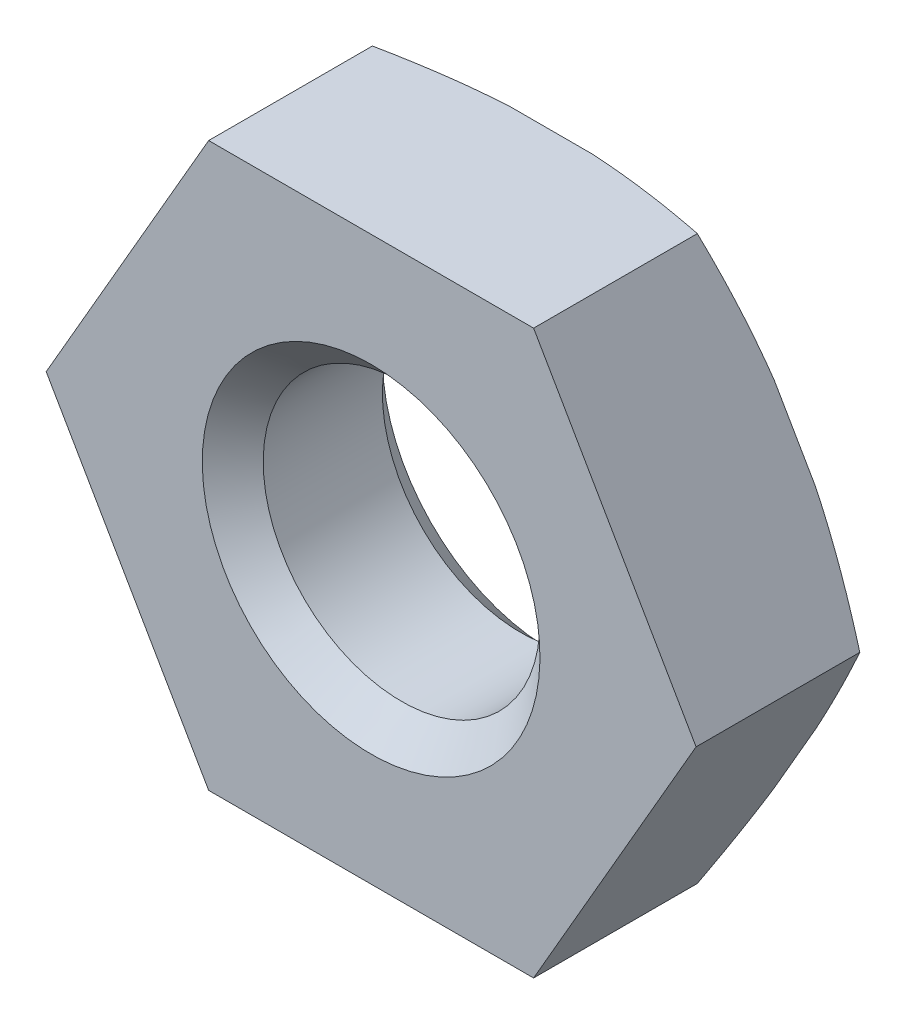
ISO-10303-21;
HEADER;
FILE_DESCRIPTION(('STEP AP214'),'2;1');
FILE_NAME('part.step','',(''),(''),'','','');
FILE_SCHEMA(('AUTOMOTIVE_DESIGN { 1 0 10303 214 1 1 1 1 }'));
ENDSEC;
DATA;
#1=APPLICATION_CONTEXT('core data for automotive mechanical design processes');
#2=APPLICATION_PROTOCOL_DEFINITION('international standard','automotive_design',2000,#1);
#3=PRODUCT_CONTEXT('',#1,'mechanical');
#4=PRODUCT('Part','Part','',(#3));
#5=PRODUCT_RELATED_PRODUCT_CATEGORY('part','',(#4));
#6=PRODUCT_DEFINITION_FORMATION('','',#4);
#7=PRODUCT_DEFINITION_CONTEXT('part definition',#1,'design');
#8=PRODUCT_DEFINITION('design','',#6,#7);
#9=PRODUCT_DEFINITION_SHAPE('','',#8);
#10=(LENGTH_UNIT() NAMED_UNIT(*) SI_UNIT(.MILLI.,.METRE.));
#11=(NAMED_UNIT(*) PLANE_ANGLE_UNIT() SI_UNIT($,.RADIAN.));
#12=(NAMED_UNIT(*) SI_UNIT($,.STERADIAN.) SOLID_ANGLE_UNIT());
#13=UNCERTAINTY_MEASURE_WITH_UNIT(LENGTH_MEASURE(1.E-05),#10,'distance_accuracy_value','');
#14=(GEOMETRIC_REPRESENTATION_CONTEXT(3) GLOBAL_UNCERTAINTY_ASSIGNED_CONTEXT((#13)) GLOBAL_UNIT_ASSIGNED_CONTEXT((#10,
#11,#12)) REPRESENTATION_CONTEXT('',''));
#15=CARTESIAN_POINT('',(0.,0.,0.));
#16=DIRECTION('',(0.,0.,1.));
#17=DIRECTION('',(1.,0.,0.));
#18=AXIS2_PLACEMENT_3D('',#15,#16,#17);
#19=CARTESIAN_POINT('',(0.,0.,0.));
#20=DIRECTION('',(0.,0.,1.));
#21=DIRECTION('',(0.,-1.,0.));
#22=AXIS2_PLACEMENT_3D('',#19,#20,#21);
#23=CONICAL_SURFACE('',#22,5.05347473355162,1.18682389135614);
#24=CARTESIAN_POINT('',(1.82959050002106,6.83105163441711,0.815465269341564));
#25=CARTESIAN_POINT('',(1.92880790925761,6.65920204062404,0.758795721254125));
#26=CARTESIAN_POINT('',(2.02824742987315,6.48696773863762,0.703633232423377));
#27=CARTESIAN_POINT('',(2.22766458701015,6.1415670905754,0.597105303293535));
#28=CARTESIAN_POINT('',(2.32764237739732,5.96840047799634,0.545741018132075));
#29=CARTESIAN_POINT('',(2.52866315419354,5.62022227920833,0.447386406731392));
#30=CARTESIAN_POINT('',(2.62970896119575,5.44520580758871,0.400418839591127));
#31=CARTESIAN_POINT('',(2.83240396169927,5.0941277682764,0.312160701057636));
#32=CARTESIAN_POINT('',(2.93405310924728,4.91806628017719,0.270869702953672));
#33=CARTESIAN_POINT('',(3.23469337829925,4.39734205937799,0.159213605448519));
#34=CARTESIAN_POINT('',(3.4346392043784,4.05102572984758,0.098380707157205));
#35=CARTESIAN_POINT('',(3.73572192465823,3.52953516104186,0.0332378113566488));
#36=CARTESIAN_POINT('',(3.83616840279296,3.35555675747117,0.0158792685037297));
#37=CARTESIAN_POINT('',(4.0373638482104,3.0070760237567,-0.00938491312245711));
#38=CARTESIAN_POINT('',(4.13811280334153,2.8325737146601,-0.0172909266754521));
#39=CARTESIAN_POINT('',(4.33459000312699,2.49226522210283,-0.0230821536612729));
#40=CARTESIAN_POINT('',(4.43031474637937,2.32646510324823,-0.0214534559323992));
#41=CARTESIAN_POINT('',(4.62162458630996,1.99510674050058,-0.00938058951432372));
#42=CARTESIAN_POINT('',(4.71720968159489,1.82954849902075,0.00106366653454495));
#43=CARTESIAN_POINT('',(4.9082544645722,1.49864922838309,0.0303167758624904));
#44=CARTESIAN_POINT('',(5.00371347873356,1.33330936581518,0.0491429686932486));
#45=CARTESIAN_POINT('',(5.19417563876743,1.0034192277172,0.0943801126728865));
#46=CARTESIAN_POINT('',(5.28917878344215,0.838868954261774,0.120791083739722));
#47=CARTESIAN_POINT('',(5.4810116896983,0.506604614062511,0.180999069089487));
#48=CARTESIAN_POINT('',(5.57782819829177,0.33891350216719,0.214963270672677));
#49=CARTESIAN_POINT('',(5.77089570841079,0.00451076535023419,0.288845085696016));
#50=CARTESIAN_POINT('',(5.86714665764616,-0.162200769002164,0.328763240893741));
#51=CARTESIAN_POINT('',(6.05870238455741,-0.493985020493238,0.413408010470125));
#52=CARTESIAN_POINT('',(6.15400941913019,-0.659061646692013,0.4581143816154));
#53=CARTESIAN_POINT('',(6.34408379339944,-0.988280120143212,0.551645017763884));
#54=CARTESIAN_POINT('',(6.43885130718169,-1.15242226892105,0.600467863467247));
#55=CARTESIAN_POINT('',(6.53338733286891,-1.31616346855696,0.650953324537465));
#56=B_SPLINE_CURVE_WITH_KNOTS('',3,(#24,#25,#26,#27,#28,#29,#30,#31,#32,#33,#34,#35,#36,#37,#38,
#39,#40,#41,#42,#43,#44,#45,#46,#47,#48,#49,#50,#51,#52,#53,#54,#55),.UNSPECIFIED.,.F.,.F.,(4,2,
2,2,2,2,2,2,2,2,2,2,2,2,2,4),(0.,0.619117029676101,1.23842158191025,1.86077258918734,
2.48307678839582,3.69514910620203,4.29988858532314,4.90460408656421,5.47876829179651,
6.05293818689903,6.62830141527549,7.2036661545945,7.79332430220596,8.38303613630728,
8.97034651479174,9.55745521893909),.UNSPECIFIED.);
#57=CARTESIAN_POINT('',(4.6967413509531,1.86500068763847,0.));
#58=VERTEX_POINT('',#57);
#59=CARTESIAN_POINT('',(5.7735,0.,0.290909090909091));
#60=VERTEX_POINT('',#59);
#61=EDGE_CURVE('E218',#58,#60,#56,.T.);
#62=ORIENTED_EDGE('',*,*,#61,.T.);
#63=CARTESIAN_POINT('',(6.53338733286891,1.31616346855696,0.650953324537465));
#64=CARTESIAN_POINT('',(6.43885130718169,1.15242226892105,0.600467863467247));
#65=CARTESIAN_POINT('',(6.34408379339944,0.988280120143211,0.551645017763884));
#66=CARTESIAN_POINT('',(6.15400941913019,0.659061646692012,0.458114381615401));
#67=CARTESIAN_POINT('',(6.05870238455741,0.493985020493236,0.413408010470125));
#68=CARTESIAN_POINT('',(5.86714665764616,0.162200769002163,0.328763240893741));
#69=CARTESIAN_POINT('',(5.77089570841079,-0.00451076535023528,0.288845085696016));
#70=CARTESIAN_POINT('',(5.57782819829177,-0.338913502167191,0.214963270672677));
#71=CARTESIAN_POINT('',(5.4810116896983,-0.506604614062512,0.180999069089487));
#72=CARTESIAN_POINT('',(5.28917878344215,-0.838868954261774,0.120791083739723));
#73=CARTESIAN_POINT('',(5.19417563876743,-1.0034192277172,0.0943801126728874));
#74=CARTESIAN_POINT('',(5.00371347873356,-1.33330936581518,0.0491429686932495));
#75=CARTESIAN_POINT('',(4.9082544645722,-1.49864922838309,0.030316775862491));
#76=CARTESIAN_POINT('',(4.71720968159489,-1.82954849902075,0.00106366653454565));
#77=CARTESIAN_POINT('',(4.62162458630996,-1.99510674050058,-0.00938058951432276));
#78=CARTESIAN_POINT('',(4.43031474637937,-2.32646510324823,-0.0214534559323987));
#79=CARTESIAN_POINT('',(4.33459000312699,-2.49226522210283,-0.0230821536612732));
#80=CARTESIAN_POINT('',(4.13811280334153,-2.8325737146601,-0.0172909266754524));
#81=CARTESIAN_POINT('',(4.0373638482104,-3.0070760237567,-0.0093849131224566));
#82=CARTESIAN_POINT('',(3.83616840279296,-3.35555675747117,0.0158792685037309));
#83=CARTESIAN_POINT('',(3.73572192465824,-3.52953516104186,0.0332378113566497));
#84=CARTESIAN_POINT('',(3.4346392043784,-4.05102572984758,0.0983807071572055));
#85=CARTESIAN_POINT('',(3.23469337829926,-4.39734205937799,0.15921360544852));
#86=CARTESIAN_POINT('',(2.93405310924728,-4.91806628017719,0.270869702953672));
#87=CARTESIAN_POINT('',(2.83240396169928,-5.0941277682764,0.312160701057635));
#88=CARTESIAN_POINT('',(2.62970896119575,-5.4452058075887,0.400418839591127));
#89=CARTESIAN_POINT('',(2.52866315419354,-5.62022227920833,0.447386406731391));
#90=CARTESIAN_POINT('',(2.32764237739733,-5.96840047799633,0.545741018132074));
#91=CARTESIAN_POINT('',(2.22766458701015,-6.14156709057539,0.597105303293534));
#92=CARTESIAN_POINT('',(2.02824742987316,-6.48696773863762,0.703633232423377));
#93=CARTESIAN_POINT('',(1.92880790925761,-6.65920204062403,0.758795721254125));
#94=CARTESIAN_POINT('',(1.82959050002105,-6.8310516344171,0.815465269341563));
#95=B_SPLINE_CURVE_WITH_KNOTS('',3,(#63,#64,#65,#66,#67,#68,#69,#70,#71,#72,#73,#74,#75,#76,#77,
#78,#79,#80,#81,#82,#83,#84,#85,#86,#87,#88,#89,#90,#91,#92,#93,#94),.UNSPECIFIED.,.F.,.F.,(4,2,
2,2,2,2,2,2,2,2,2,2,2,2,2,4),(0.,0.587108704147354,1.17441908263181,1.76413091673313,
2.35378906434459,2.9291538036636,3.50451703204006,4.07868692714258,4.65285113237489,
5.25756663361595,5.86230611273706,7.07437843054326,7.69668262975175,8.31903363702884,
8.93833818926298,9.55745521893908),.UNSPECIFIED.);
#96=CARTESIAN_POINT('',(4.6967413509531,-1.86500068763846,0.));
#97=VERTEX_POINT('',#96);
#98=EDGE_CURVE('E54',#60,#97,#95,.T.);
#99=ORIENTED_EDGE('',*,*,#98,.T.);
#100=CARTESIAN_POINT('',(0.,0.,0.));
#101=DIRECTION('',(0.,0.,1.));
#102=DIRECTION('',(1.,0.,0.));
#103=AXIS2_PLACEMENT_3D('',#100,#101,#102);
#104=CIRCLE('',#103,5.05347473355162);
#105=EDGE_CURVE('E42',#97,#58,#104,.T.);
#106=ORIENTED_EDGE('',*,*,#105,.T.);
#107=EDGE_LOOP('',(#62,#99,#106));
#108=FACE_BOUND('',#107,.T.);
#109=ADVANCED_FACE('F37',(#108),#23,.T.);
#110=CARTESIAN_POINT('',(5.7735,0.,0.));
#111=DIRECTION('',(0.,0.,1.));
#112=DIRECTION('',(1.,0.,0.));
#113=AXIS2_PLACEMENT_3D('',#110,#111,#112);
#114=PLANE('',#113);
#115=CARTESIAN_POINT('',(0.,0.,0.));
#116=DIRECTION('',(0.,0.,-1.));
#117=DIRECTION('',(0.,1.,0.));
#118=AXIS2_PLACEMENT_3D('',#115,#116,#117);
#119=CIRCLE('',#118,5.05347473355162);
#120=CARTESIAN_POINT('',(0.733232701906193,4.99999766874946,0.));
#121=VERTEX_POINT('',#120);
#122=CARTESIAN_POINT('',(3.9635086490469,3.134996981111,0.));
#123=VERTEX_POINT('',#122);
#124=EDGE_CURVE('E249',#121,#123,#119,.T.);
#125=ORIENTED_EDGE('',*,*,#124,.T.);
#126=DIRECTION('',(-0.5,0.866025403784439,0.));
#127=VECTOR('',#126,1.);
#128=CARTESIAN_POINT('',(5.7735,0.,0.));
#129=LINE('',#128,#127);
#130=EDGE_CURVE('E211',#58,#123,#129,.T.);
#131=ORIENTED_EDGE('',*,*,#130,.F.);
#132=ORIENTED_EDGE('',*,*,#105,.F.);
#133=DIRECTION('',(0.5,0.866025403784439,0.));
#134=VECTOR('',#133,1.);
#135=CARTESIAN_POINT('',(2.88675,-4.99999766874946,0.));
#136=LINE('',#135,#134);
#137=CARTESIAN_POINT('',(3.9635086490469,-3.134996981111,0.));
#138=VERTEX_POINT('',#137);
#139=EDGE_CURVE('E216',#138,#97,#136,.T.);
#140=ORIENTED_EDGE('',*,*,#139,.F.);
#141=CARTESIAN_POINT('',(0.733232701906185,-4.99999766874946,0.));
#142=VERTEX_POINT('',#141);
#143=EDGE_CURVE('E175',#142,#138,#104,.T.);
#144=ORIENTED_EDGE('',*,*,#143,.F.);
#145=DIRECTION('',(1.,0.,0.));
#146=VECTOR('',#145,1.);
#147=CARTESIAN_POINT('',(-2.88675,-4.99999766874946,0.));
#148=LINE('',#147,#146);
#149=CARTESIAN_POINT('',(-0.733232701906189,-4.99999766874946,0.));
#150=VERTEX_POINT('',#149);
#151=EDGE_CURVE('E163',#150,#142,#148,.T.);
#152=ORIENTED_EDGE('',*,*,#151,.F.);
#153=CARTESIAN_POINT('',(-3.96350864904691,-3.13499698111098,0.));
#154=VERTEX_POINT('',#153);
#155=EDGE_CURVE('E178',#154,#150,#104,.T.);
#156=ORIENTED_EDGE('',*,*,#155,.F.);
#157=DIRECTION('',(0.5,-0.866025403784439,0.));
#158=VECTOR('',#157,1.);
#159=CARTESIAN_POINT('',(-5.7735,0.,0.));
#160=LINE('',#159,#158);
#161=CARTESIAN_POINT('',(-4.69674135095309,-1.86500068763847,0.));
#162=VERTEX_POINT('',#161);
#163=EDGE_CURVE('E201',#162,#154,#160,.T.);
#164=ORIENTED_EDGE('',*,*,#163,.F.);
#165=CARTESIAN_POINT('',(-4.69674135095309,1.86500068763847,0.));
#166=VERTEX_POINT('',#165);
#167=EDGE_CURVE('E47',#166,#162,#104,.T.);
#168=ORIENTED_EDGE('',*,*,#167,.F.);
#169=DIRECTION('',(-0.5,-0.866025403784439,0.));
#170=VECTOR('',#169,1.);
#171=CARTESIAN_POINT('',(-2.88675,4.99999766874946,0.));
#172=LINE('',#171,#170);
#173=CARTESIAN_POINT('',(-3.9635086490469,3.13499698111099,0.));
#174=VERTEX_POINT('',#173);
#175=EDGE_CURVE('E198',#174,#166,#172,.T.);
#176=ORIENTED_EDGE('',*,*,#175,.F.);
#177=CARTESIAN_POINT('',(-0.73323270190619,4.99999766874946,0.));
#178=VERTEX_POINT('',#177);
#179=EDGE_CURVE('E11',#178,#174,#104,.T.);
#180=ORIENTED_EDGE('',*,*,#179,.F.);
#181=DIRECTION('',(-1.,0.,0.));
#182=VECTOR('',#181,1.);
#183=CARTESIAN_POINT('',(2.88675,4.99999766874946,0.));
#184=LINE('',#183,#182);
#185=EDGE_CURVE('E207',#121,#178,#184,.T.);
#186=ORIENTED_EDGE('',*,*,#185,.F.);
#187=EDGE_LOOP('',(#125,#131,#132,#140,#144,#152,#156,#164,#168,#176,#180,#186));
#188=FACE_BOUND('',#187,.T.);
#189=CARTESIAN_POINT('',(0.,0.,0.));
#190=DIRECTION('',(0.,0.,-1.));
#191=DIRECTION('',(0.,1.,0.));
#192=AXIS2_PLACEMENT_3D('',#189,#190,#191);
#193=CIRCLE('',#192,3.);
#194=CARTESIAN_POINT('',(0.,3.,0.));
#195=VERTEX_POINT('',#194);
#196=EDGE_CURVE('E251',#195,#195,#193,.T.);
#197=ORIENTED_EDGE('',*,*,#196,.F.);
#198=EDGE_LOOP('',(#197));
#199=FACE_BOUND('',#198,.T.);
#200=ADVANCED_FACE('F196',(#188,#199),#114,.F.);
#201=CARTESIAN_POINT('',(2.88675,-4.99999766874946,3.2));
#202=DIRECTION('',(-0.866025403784439,0.5,0.));
#203=DIRECTION('',(-0.5,-0.866025403784439,0.));
#204=AXIS2_PLACEMENT_3D('',#201,#202,#203);
#205=PLANE('',#204);
#206=DIRECTION('',(0.,0.,-1.));
#207=VECTOR('',#206,1.);
#208=CARTESIAN_POINT('',(5.7735,0.,3.2));
#209=LINE('',#208,#207);
#210=CARTESIAN_POINT('',(5.7735,0.,3.2));
#211=VERTEX_POINT('',#210);
#212=EDGE_CURVE('E146',#211,#60,#209,.T.);
#213=ORIENTED_EDGE('',*,*,#212,.F.);
#214=DIRECTION('',(0.5,0.866025403784439,0.));
#215=VECTOR('',#214,1.);
#216=CARTESIAN_POINT('',(2.88675,-4.99999766874946,3.2));
#217=LINE('',#216,#215);
#218=CARTESIAN_POINT('',(2.88675,-4.99999766874946,3.2));
#219=VERTEX_POINT('',#218);
#220=EDGE_CURVE('E139',#219,#211,#217,.T.);
#221=ORIENTED_EDGE('',*,*,#220,.F.);
#222=DIRECTION('',(0.,0.,-1.));
#223=VECTOR('',#222,1.);
#224=CARTESIAN_POINT('',(2.88675,-4.99999766874946,3.2));
#225=LINE('',#224,#223);
#226=CARTESIAN_POINT('',(2.88675,-4.99999766874946,0.290909090909092));
#227=VERTEX_POINT('',#226);
#228=EDGE_CURVE('E161',#219,#227,#225,.T.);
#229=ORIENTED_EDGE('',*,*,#228,.T.);
#230=EDGE_CURVE('E220',#138,#227,#95,.T.);
#231=ORIENTED_EDGE('',*,*,#230,.F.);
#232=ORIENTED_EDGE('',*,*,#139,.T.);
#233=ORIENTED_EDGE('',*,*,#98,.F.);
#234=EDGE_LOOP('',(#213,#221,#229,#231,#232,#233));
#235=FACE_BOUND('',#234,.T.);
#236=ADVANCED_FACE('F39',(#235),#205,.F.);
#237=CARTESIAN_POINT('',(5.7735,0.,3.2));
#238=DIRECTION('',(-0.866025403784439,-0.5,0.));
#239=DIRECTION('',(0.5,-0.866025403784439,0.));
#240=AXIS2_PLACEMENT_3D('',#237,#238,#239);
#241=PLANE('',#240);
#242=DIRECTION('',(0.,0.,-1.));
#243=VECTOR('',#242,1.);
#244=CARTESIAN_POINT('',(2.88675,4.99999766874946,3.2));
#245=LINE('',#244,#243);
#246=CARTESIAN_POINT('',(2.88675,4.99999766874946,3.2));
#247=VERTEX_POINT('',#246);
#248=CARTESIAN_POINT('',(2.88675,4.99999766874946,0.290909090909091));
#249=VERTEX_POINT('',#248);
#250=EDGE_CURVE('E141',#247,#249,#245,.T.);
#251=ORIENTED_EDGE('',*,*,#250,.F.);
#252=DIRECTION('',(-0.5,0.866025403784439,0.));
#253=VECTOR('',#252,1.);
#254=CARTESIAN_POINT('',(5.7735,0.,3.2));
#255=LINE('',#254,#253);
#256=EDGE_CURVE('E132',#211,#247,#255,.T.);
#257=ORIENTED_EDGE('',*,*,#256,.F.);
#258=ORIENTED_EDGE('',*,*,#212,.T.);
#259=ORIENTED_EDGE('',*,*,#61,.F.);
#260=ORIENTED_EDGE('',*,*,#130,.T.);
#261=EDGE_CURVE('E62',#249,#123,#56,.T.);
#262=ORIENTED_EDGE('',*,*,#261,.F.);
#263=EDGE_LOOP('',(#251,#257,#258,#259,#260,#262));
#264=FACE_BOUND('',#263,.T.);
#265=ADVANCED_FACE('F142',(#264),#241,.F.);
#266=CARTESIAN_POINT('',(2.88675,4.99999766874946,3.2));
#267=DIRECTION('',(0.,-1.,0.));
#268=DIRECTION('',(1.,0.,0.));
#269=AXIS2_PLACEMENT_3D('',#266,#267,#268);
#270=PLANE('',#269);
#271=DIRECTION('',(0.,0.,-1.));
#272=VECTOR('',#271,1.);
#273=CARTESIAN_POINT('',(-2.88675,4.99999766874946,3.2));
#274=LINE('',#273,#272);
#275=CARTESIAN_POINT('',(-2.88675,4.99999766874946,3.2));
#276=VERTEX_POINT('',#275);
#277=CARTESIAN_POINT('',(-2.88675,4.99999766874946,0.290909090909091));
#278=VERTEX_POINT('',#277);
#279=EDGE_CURVE('E147',#276,#278,#274,.T.);
#280=ORIENTED_EDGE('',*,*,#279,.F.);
#281=DIRECTION('',(-1.,0.,0.));
#282=VECTOR('',#281,1.);
#283=CARTESIAN_POINT('',(2.88675,4.99999766874946,3.2));
#284=LINE('',#283,#282);
#285=EDGE_CURVE('E136',#247,#276,#284,.T.);
#286=ORIENTED_EDGE('',*,*,#285,.F.);
#287=ORIENTED_EDGE('',*,*,#250,.T.);
#288=CARTESIAN_POINT('',(-7.6494870542568,4.99999766874946,1.65051142497992));
#289=CARTESIAN_POINT('',(-7.42376934287327,4.99999766874946,1.57419764007641));
#290=CARTESIAN_POINT('',(-7.1977524814291,4.99999766874946,1.49875243104177));
#291=CARTESIAN_POINT('',(-6.7449656383747,4.99999766874946,1.35008435148112));
#292=CARTESIAN_POINT('',(-6.51819558586565,4.99999766874946,1.27686169714585));
#293=CARTESIAN_POINT('',(-6.06324773224512,4.99999766874946,1.13296699196577));
#294=CARTESIAN_POINT('',(-5.83506786121411,4.99999766874946,1.06230146190092));
#295=CARTESIAN_POINT('',(-5.37768085371117,4.99999766874946,0.924384004093435));
#296=CARTESIAN_POINT('',(-5.14847374212687,4.99999766874946,0.85713199413054));
#297=CARTESIAN_POINT('',(-4.6917706530822,4.99999766874946,0.727730854331583));
#298=CARTESIAN_POINT('',(-4.4642900798269,4.99999766874946,0.665527627675359));
#299=CARTESIAN_POINT('',(-4.00794790108791,4.99999766874946,0.546344497836445));
#300=CARTESIAN_POINT('',(-3.7790862555429,4.99999766874946,0.489364746957073));
#301=CARTESIAN_POINT('',(-3.31994508112967,4.99999766874946,0.381983037902952));
#302=CARTESIAN_POINT('',(-3.08966640276439,4.99999766874946,0.33157747357405));
#303=CARTESIAN_POINT('',(-2.62747127398661,4.99999766874946,0.238896563661601));
#304=CARTESIAN_POINT('',(-2.39555494158888,4.99999766874946,0.196620638304607));
#305=CARTESIAN_POINT('',(-1.97768346938518,4.99999766874946,0.129593506411649));
#306=CARTESIAN_POINT('',(-1.79202107847923,4.99999766874946,0.103026518948002));
#307=CARTESIAN_POINT('',(-1.41981730134858,4.99999766874946,0.0570422053252058));
#308=CARTESIAN_POINT('',(-1.23327599159887,4.99999766874946,0.0376242683492716));
#309=CARTESIAN_POINT('',(-0.859647527307505,4.99999766874946,0.00670352275259467));
#310=CARTESIAN_POINT('',(-0.672560787268084,4.99999766874946,-0.00480423011517691));
#311=CARTESIAN_POINT('',(-0.298056218227699,4.99999766874946,-0.0194210462812321));
#312=CARTESIAN_POINT('',(-0.110638391987549,4.99999766874946,-0.0225301792850246));
#313=CARTESIAN_POINT('',(0.265040926427727,4.99999766874946,-0.0202005367541315));
#314=CARTESIAN_POINT('',(0.453302161719749,4.99999766874946,-0.0147207642484683));
#315=CARTESIAN_POINT('',(0.829391029736758,4.99999766874946,0.00461016048064915));
#316=CARTESIAN_POINT('',(1.01721865530477,4.99999766874946,0.0184614499030109));
#317=CARTESIAN_POINT('',(1.39224848382382,4.99999766874946,0.0539511999056781));
#318=CARTESIAN_POINT('',(1.57945020982279,4.99999766874946,0.0755946363351951));
#319=CARTESIAN_POINT('',(1.95290412774967,4.99999766874946,0.125848162026985));
#320=CARTESIAN_POINT('',(2.13915632206492,4.99999766874946,0.154458233764714));
#321=CARTESIAN_POINT('',(2.54122932251031,4.99999766874946,0.222949376740556));
#322=CARTESIAN_POINT('',(2.75686486426119,4.99999766874946,0.263910871614241));
#323=CARTESIAN_POINT('',(3.18673330416382,4.99999766874946,0.352646218862747));
#324=CARTESIAN_POINT('',(3.40096607343844,4.99999766874946,0.400420688231264));
#325=CARTESIAN_POINT('',(3.82821655363544,4.99999766874946,0.501551080364819));
#326=CARTESIAN_POINT('',(4.04123358508095,4.99999766874946,0.55490985296558));
#327=CARTESIAN_POINT('',(4.4660726492711,4.99999766874946,0.666132058028477));
#328=CARTESIAN_POINT('',(4.67789472631664,4.99999766874946,0.723995322301507));
#329=CARTESIAN_POINT('',(5.10106120913675,4.99999766874946,0.843527214856067));
#330=CARTESIAN_POINT('',(5.31240288226844,4.99999766874946,0.905205475650638));
#331=CARTESIAN_POINT('',(5.734193169917,4.99999766874946,1.0315457124526));
#332=CARTESIAN_POINT('',(5.94464176821211,4.99999766874946,1.09620774240579));
#333=CARTESIAN_POINT('',(6.57472766632598,4.99999766874946,1.29378072864579));
#334=CARTESIAN_POINT('',(6.99322804029386,4.99999766874946,1.43031405548193));
#335=CARTESIAN_POINT('',(7.82535294478487,4.99999766874946,1.70902532348774));
#336=CARTESIAN_POINT('',(8.23899154640591,4.99999766874946,1.85116166317533));
#337=CARTESIAN_POINT('',(9.06470073745745,4.99999766874946,2.14000618293336));
#338=CARTESIAN_POINT('',(9.47677120501807,4.99999766874946,2.28671471051253));
#339=CARTESIAN_POINT('',(10.2969793590909,4.99999766874946,2.58244594070132));
#340=CARTESIAN_POINT('',(10.7051249659199,4.99999766874946,2.73144673901131));
#341=CARTESIAN_POINT('',(11.3166437007458,4.99999766874946,2.95676299184967));
#342=CARTESIAN_POINT('',(11.5203538114566,4.99999766874946,3.03216609489081));
#343=CARTESIAN_POINT('',(11.9275748095856,4.99999766874946,3.18350617291714));
#344=CARTESIAN_POINT('',(12.1310856977328,4.99999766874946,3.25944314594065));
#345=CARTESIAN_POINT('',(12.3345104006614,4.99999766874945,3.33561025258897));
#346=B_SPLINE_CURVE_WITH_KNOTS('',3,(#288,#289,#290,#291,#292,#293,#294,#295,#296,#297,#298,
#299,#300,#301,#302,#303,#304,#305,#306,#307,#308,#309,#310,#311,#312,#313,#314,#315,#316,#317,
#318,#319,#320,#321,#322,#323,#324,#325,#326,#327,#328,#329,#330,#331,#332,#333,#334,#335,#336,
#337,#338,#339,#340,#341,#342,#343,#344,#345),.UNSPECIFIED.,.F.,.F.,(4,2,2,2,2,2,2,2,2,2,2,2,2,
2,2,2,2,2,2,2,2,2,2,2,2,2,2,2,4),(0.,0.71481404720393,1.42969740390628,2.14629095405642,
2.86286723566849,3.57031398878342,4.27778136269653,4.98485902096002,5.69188623454726,
6.25442747796277,6.81692064654384,7.37906190924547,7.94119850636348,8.50602650263642,
9.07086375599935,9.63606234040549,10.2012595030715,10.85959655414,11.5179932631541,
12.1767276252981,12.8354374033468,13.4958842246602,14.1563429913691,15.4768766754237,
16.7889797531731,18.1011828015859,19.4046513283029,20.0563032112779,20.7079527010179),.UNSPECIFIED.);
#347=EDGE_CURVE('E302',#121,#249,#346,.T.);
#348=ORIENTED_EDGE('',*,*,#347,.F.);
#349=ORIENTED_EDGE('',*,*,#185,.T.);
#350=EDGE_CURVE('E297',#278,#178,#346,.T.);
#351=ORIENTED_EDGE('',*,*,#350,.F.);
#352=EDGE_LOOP('',(#280,#286,#287,#348,#349,#351));
#353=FACE_BOUND('',#352,.T.);
#354=ADVANCED_FACE('F149',(#353),#270,.F.);
#355=CARTESIAN_POINT('',(-2.88675,4.99999766874946,3.2));
#356=DIRECTION('',(0.866025403784439,-0.5,0.));
#357=DIRECTION('',(0.5,0.866025403784439,0.));
#358=AXIS2_PLACEMENT_3D('',#355,#356,#357);
#359=PLANE('',#358);
#360=DIRECTION('',(0.,0.,-1.));
#361=VECTOR('',#360,1.);
#362=CARTESIAN_POINT('',(-5.7735,0.,3.2));
#363=LINE('',#362,#361);
#364=CARTESIAN_POINT('',(-5.7735,0.,3.2));
#365=VERTEX_POINT('',#364);
#366=CARTESIAN_POINT('',(-5.7735,0.,0.290909090909091));
#367=VERTEX_POINT('',#366);
#368=EDGE_CURVE('E169',#365,#367,#363,.T.);
#369=ORIENTED_EDGE('',*,*,#368,.F.);
#370=DIRECTION('',(-0.5,-0.866025403784439,0.));
#371=VECTOR('',#370,1.);
#372=CARTESIAN_POINT('',(-2.88675,4.99999766874946,3.2));
#373=LINE('',#372,#371);
#374=EDGE_CURVE('E151',#276,#365,#373,.T.);
#375=ORIENTED_EDGE('',*,*,#374,.F.);
#376=ORIENTED_EDGE('',*,*,#279,.T.);
#377=CARTESIAN_POINT('',(-6.53338733286891,-1.31616346855696,0.650953324537465));
#378=CARTESIAN_POINT('',(-6.43885130718169,-1.15242226892105,0.600467863467248));
#379=CARTESIAN_POINT('',(-6.34408379339944,-0.988280120143211,0.551645017763884));
#380=CARTESIAN_POINT('',(-6.15400941913019,-0.659061646692013,0.458114381615401));
#381=CARTESIAN_POINT('',(-6.05870238455741,-0.493985020493237,0.413408010470125));
#382=CARTESIAN_POINT('',(-5.86714665764616,-0.162200769002163,0.328763240893741));
#383=CARTESIAN_POINT('',(-5.77089570841079,0.00451076535023514,0.288845085696016));
#384=CARTESIAN_POINT('',(-5.57782819829177,0.338913502167191,0.214963270672677));
#385=CARTESIAN_POINT('',(-5.4810116896983,0.506604614062511,0.180999069089487));
#386=CARTESIAN_POINT('',(-5.28917878344215,0.838868954261774,0.120791083739722));
#387=CARTESIAN_POINT('',(-5.19417563876743,1.0034192277172,0.0943801126728872));
#388=CARTESIAN_POINT('',(-5.00371347873356,1.33330936581518,0.0491429686932492));
#389=CARTESIAN_POINT('',(-4.9082544645722,1.49864922838309,0.0303167758624906));
#390=CARTESIAN_POINT('',(-4.71720968159489,1.82954849902075,0.0010636665345453));
#391=CARTESIAN_POINT('',(-4.62162458630996,1.99510674050058,-0.009380589514323));
#392=CARTESIAN_POINT('',(-4.43031474637937,2.32646510324823,-0.0214534559323987));
#393=CARTESIAN_POINT('',(-4.33459000312699,2.49226522210283,-0.023082153661273));
#394=CARTESIAN_POINT('',(-4.13811280334153,2.8325737146601,-0.0172909266754523));
#395=CARTESIAN_POINT('',(-4.0373638482104,3.0070760237567,-0.00938491312245687));
#396=CARTESIAN_POINT('',(-3.83616840279296,3.35555675747117,0.0158792685037304));
#397=CARTESIAN_POINT('',(-3.73572192465824,3.52953516104186,0.0332378113566494));
#398=CARTESIAN_POINT('',(-3.4346392043784,4.05102572984758,0.0983807071572052));
#399=CARTESIAN_POINT('',(-3.23469337829926,4.39734205937799,0.159213605448519));
#400=CARTESIAN_POINT('',(-2.93405310924728,4.91806628017719,0.270869702953672));
#401=CARTESIAN_POINT('',(-2.83240396169928,5.0941277682764,0.312160701057635));
#402=CARTESIAN_POINT('',(-2.62970896119575,5.4452058075887,0.400418839591126));
#403=CARTESIAN_POINT('',(-2.52866315419354,5.62022227920833,0.447386406731391));
#404=CARTESIAN_POINT('',(-2.32764237739733,5.96840047799633,0.545741018132074));
#405=CARTESIAN_POINT('',(-2.22766458701015,6.14156709057539,0.597105303293534));
#406=CARTESIAN_POINT('',(-2.02824742987316,6.48696773863762,0.703633232423376));
#407=CARTESIAN_POINT('',(-1.92880790925761,6.65920204062403,0.758795721254123));
#408=CARTESIAN_POINT('',(-1.82959050002106,6.8310516344171,0.815465269341561));
#409=B_SPLINE_CURVE_WITH_KNOTS('',3,(#377,#378,#379,#380,#381,#382,#383,#384,#385,#386,#387,
#388,#389,#390,#391,#392,#393,#394,#395,#396,#397,#398,#399,#400,#401,#402,#403,#404,#405,#406,
#407,#408),.UNSPECIFIED.,.F.,.F.,(4,2,2,2,2,2,2,2,2,2,2,2,2,2,2,4),(0.,0.587108704147353,
1.17441908263181,1.76413091673313,2.35378906434459,2.9291538036636,3.50451703204006,
4.07868692714258,4.65285113237489,5.25756663361595,5.86230611273706,7.07437843054326,
7.69668262975175,8.31903363702884,8.93833818926298,9.55745521893908),.UNSPECIFIED.);
#410=EDGE_CURVE('E206',#174,#278,#409,.T.);
#411=ORIENTED_EDGE('',*,*,#410,.F.);
#412=ORIENTED_EDGE('',*,*,#175,.T.);
#413=EDGE_CURVE('E193',#367,#166,#409,.T.);
#414=ORIENTED_EDGE('',*,*,#413,.F.);
#415=EDGE_LOOP('',(#369,#375,#376,#411,#412,#414));
#416=FACE_BOUND('',#415,.T.);
#417=ADVANCED_FACE('F204',(#416),#359,.F.);
#418=CARTESIAN_POINT('',(-5.7735,0.,3.2));
#419=DIRECTION('',(0.866025403784439,0.5,0.));
#420=DIRECTION('',(-0.5,0.866025403784439,0.));
#421=AXIS2_PLACEMENT_3D('',#418,#419,#420);
#422=PLANE('',#421);
#423=DIRECTION('',(0.,0.,-1.));
#424=VECTOR('',#423,1.);
#425=CARTESIAN_POINT('',(-2.88675,-4.99999766874945,3.2));
#426=LINE('',#425,#424);
#427=CARTESIAN_POINT('',(-2.88675,-4.99999766874945,3.2));
#428=VERTEX_POINT('',#427);
#429=CARTESIAN_POINT('',(-2.88675,-4.99999766874945,0.290909090909091));
#430=VERTEX_POINT('',#429);
#431=EDGE_CURVE('E166',#428,#430,#426,.T.);
#432=ORIENTED_EDGE('',*,*,#431,.F.);
#433=DIRECTION('',(0.5,-0.866025403784439,0.));
#434=VECTOR('',#433,1.);
#435=CARTESIAN_POINT('',(-5.7735,0.,3.2));
#436=LINE('',#435,#434);
#437=EDGE_CURVE('E153',#365,#428,#436,.T.);
#438=ORIENTED_EDGE('',*,*,#437,.F.);
#439=ORIENTED_EDGE('',*,*,#368,.T.);
#440=CARTESIAN_POINT('',(-1.82959050002106,-6.8310516344171,0.815465269341564));
#441=CARTESIAN_POINT('',(-1.92880790925761,-6.65920204062403,0.758795721254124));
#442=CARTESIAN_POINT('',(-2.02824742987315,-6.48696773863762,0.703633232423376));
#443=CARTESIAN_POINT('',(-2.22766458701015,-6.14156709057539,0.597105303293533));
#444=CARTESIAN_POINT('',(-2.32764237739733,-5.96840047799633,0.545741018132074));
#445=CARTESIAN_POINT('',(-2.52866315419354,-5.62022227920833,0.447386406731391));
#446=CARTESIAN_POINT('',(-2.62970896119575,-5.4452058075887,0.400418839591126));
#447=CARTESIAN_POINT('',(-2.83240396169928,-5.0941277682764,0.312160701057635));
#448=CARTESIAN_POINT('',(-2.93405310924728,-4.91806628017719,0.270869702953672));
#449=CARTESIAN_POINT('',(-3.23469337829926,-4.39734205937799,0.159213605448519));
#450=CARTESIAN_POINT('',(-3.4346392043784,-4.05102572984758,0.0983807071572052));
#451=CARTESIAN_POINT('',(-3.73572192465824,-3.52953516104186,0.033237811356649));
#452=CARTESIAN_POINT('',(-3.83616840279295,-3.35555675747116,0.0158792685037299));
#453=CARTESIAN_POINT('',(-4.0373638482104,-3.0070760237567,-0.00938491312245679));
#454=CARTESIAN_POINT('',(-4.13811280334154,-2.8325737146601,-0.0172909266754515));
#455=CARTESIAN_POINT('',(-4.33459000312699,-2.49226522210283,-0.0230821536612723));
#456=CARTESIAN_POINT('',(-4.43031474637937,-2.32646510324822,-0.0214534559323988));
#457=CARTESIAN_POINT('',(-4.62162458630996,-1.99510674050057,-0.00938058951432358));
#458=CARTESIAN_POINT('',(-4.71720968159489,-1.82954849902075,0.00106366653454503));
#459=CARTESIAN_POINT('',(-4.9082544645722,-1.49864922838308,0.0303167758624906));
#460=CARTESIAN_POINT('',(-5.00371347873356,-1.33330936581517,0.0491429686932491));
#461=CARTESIAN_POINT('',(-5.19417563876743,-1.00341922771719,0.0943801126728871));
#462=CARTESIAN_POINT('',(-5.28917878344215,-0.838868954261771,0.120791083739722));
#463=CARTESIAN_POINT('',(-5.4810116896983,-0.506604614062509,0.180999069089487));
#464=CARTESIAN_POINT('',(-5.57782819829178,-0.338913502167188,0.214963270672677));
#465=CARTESIAN_POINT('',(-5.77089570841079,-0.00451076535023224,0.288845085696017));
#466=CARTESIAN_POINT('',(-5.86714665764616,0.162200769002166,0.328763240893742));
#467=CARTESIAN_POINT('',(-6.05870238455741,0.49398502049324,0.413408010470126));
#468=CARTESIAN_POINT('',(-6.15400941913019,0.659061646692016,0.458114381615401));
#469=CARTESIAN_POINT('',(-6.34408379339944,0.988280120143215,0.551645017763884));
#470=CARTESIAN_POINT('',(-6.43885130718169,1.15242226892105,0.600467863467247));
#471=CARTESIAN_POINT('',(-6.53338733286891,1.31616346855696,0.650953324537464));
#472=B_SPLINE_CURVE_WITH_KNOTS('',3,(#440,#441,#442,#443,#444,#445,#446,#447,#448,#449,#450,
#451,#452,#453,#454,#455,#456,#457,#458,#459,#460,#461,#462,#463,#464,#465,#466,#467,#468,#469,
#470,#471),.UNSPECIFIED.,.F.,.F.,(4,2,2,2,2,2,2,2,2,2,2,2,2,2,2,4),(0.,0.619117029676101,
1.23842158191025,1.86077258918734,2.48307678839582,3.69514910620203,4.29988858532314,
4.9046040865642,5.47876829179651,6.05293818689902,6.62830141527549,7.2036661545945,
7.79332430220596,8.38303613630727,8.97034651479173,9.55745521893908),.UNSPECIFIED.);
#473=EDGE_CURVE('E192',#162,#367,#472,.T.);
#474=ORIENTED_EDGE('',*,*,#473,.F.);
#475=ORIENTED_EDGE('',*,*,#163,.T.);
#476=EDGE_CURVE('E229',#430,#154,#472,.T.);
#477=ORIENTED_EDGE('',*,*,#476,.F.);
#478=EDGE_LOOP('',(#432,#438,#439,#474,#475,#477));
#479=FACE_BOUND('',#478,.T.);
#480=ADVANCED_FACE('F274',(#479),#422,.F.);
#481=CARTESIAN_POINT('',(-2.88675,-4.99999766874946,3.2));
#482=DIRECTION('',(0.,1.,0.));
#483=DIRECTION('',(-1.,0.,0.));
#484=AXIS2_PLACEMENT_3D('',#481,#482,#483);
#485=PLANE('',#484);
#486=ORIENTED_EDGE('',*,*,#228,.F.);
#487=DIRECTION('',(1.,0.,0.));
#488=VECTOR('',#487,1.);
#489=CARTESIAN_POINT('',(-2.88675,-4.99999766874946,3.2));
#490=LINE('',#489,#488);
#491=EDGE_CURVE('E159',#428,#219,#490,.T.);
#492=ORIENTED_EDGE('',*,*,#491,.F.);
#493=ORIENTED_EDGE('',*,*,#431,.T.);
#494=CARTESIAN_POINT('',(-7.6494870542568,-4.99999766874945,1.65051142497992));
#495=CARTESIAN_POINT('',(-7.42376934287327,-4.99999766874945,1.57419764007641));
#496=CARTESIAN_POINT('',(-7.1977524814291,-4.99999766874946,1.49875243104177));
#497=CARTESIAN_POINT('',(-6.7449656383747,-4.99999766874946,1.35008435148112));
#498=CARTESIAN_POINT('',(-6.51819558586565,-4.99999766874946,1.27686169714585));
#499=CARTESIAN_POINT('',(-6.06324773224512,-4.99999766874946,1.13296699196578));
#500=CARTESIAN_POINT('',(-5.83506786121412,-4.99999766874946,1.06230146190092));
#501=CARTESIAN_POINT('',(-5.37768085371117,-4.99999766874946,0.924384004093435));
#502=CARTESIAN_POINT('',(-5.14847374212688,-4.99999766874946,0.85713199413054));
#503=CARTESIAN_POINT('',(-4.6917706530822,-4.99999766874946,0.727730854331584));
#504=CARTESIAN_POINT('',(-4.4642900798269,-4.99999766874946,0.66552762767536));
#505=CARTESIAN_POINT('',(-4.00794790108792,-4.99999766874946,0.546344497836446));
#506=CARTESIAN_POINT('',(-3.7790862555429,-4.99999766874946,0.489364746957073));
#507=CARTESIAN_POINT('',(-3.31994508112968,-4.99999766874946,0.381983037902953));
#508=CARTESIAN_POINT('',(-3.0896664027644,-4.99999766874946,0.331577473574051));
#509=CARTESIAN_POINT('',(-2.62747127398661,-4.99999766874946,0.238896563661602));
#510=CARTESIAN_POINT('',(-2.39555494158889,-4.99999766874946,0.196620638304608));
#511=CARTESIAN_POINT('',(-1.97768346938519,-4.99999766874946,0.12959350641165));
#512=CARTESIAN_POINT('',(-1.79202107847924,-4.99999766874946,0.103026518948004));
#513=CARTESIAN_POINT('',(-1.41981730134858,-4.99999766874946,0.0570422053252072));
#514=CARTESIAN_POINT('',(-1.23327599159888,-4.99999766874946,0.0376242683492728));
#515=CARTESIAN_POINT('',(-0.85964752730751,-4.99999766874946,0.00670352275259572));
#516=CARTESIAN_POINT('',(-0.672560787268089,-4.99999766874946,-0.00480423011517592));
#517=CARTESIAN_POINT('',(-0.298056218227703,-4.99999766874946,-0.019421046281231));
#518=CARTESIAN_POINT('',(-0.110638391987553,-4.99999766874946,-0.0225301792850235));
#519=CARTESIAN_POINT('',(0.265040926427724,-4.99999766874946,-0.0202005367541303));
#520=CARTESIAN_POINT('',(0.453302161719747,-4.99999766874946,-0.0147207642484671));
#521=CARTESIAN_POINT('',(0.829391029736755,-4.99999766874946,0.00461016048065056));
#522=CARTESIAN_POINT('',(1.01721865530477,-4.99999766874946,0.0184614499030125));
#523=CARTESIAN_POINT('',(1.39224848382381,-4.99999766874946,0.0539511999056796));
#524=CARTESIAN_POINT('',(1.57945020982279,-4.99999766874946,0.0755946363351966));
#525=CARTESIAN_POINT('',(1.95290412774967,-4.99999766874946,0.125848162026986));
#526=CARTESIAN_POINT('',(2.13915632206492,-4.99999766874946,0.154458233764715));
#527=CARTESIAN_POINT('',(2.54122932251031,-4.99999766874946,0.222949376740557));
#528=CARTESIAN_POINT('',(2.75686486426118,-4.99999766874946,0.263910871614242));
#529=CARTESIAN_POINT('',(3.18673330416382,-4.99999766874946,0.352646218862749));
#530=CARTESIAN_POINT('',(3.40096607343844,-4.99999766874946,0.400420688231266));
#531=CARTESIAN_POINT('',(3.82821655363545,-4.99999766874946,0.501551080364821));
#532=CARTESIAN_POINT('',(4.04123358508095,-4.99999766874946,0.554909852965582));
#533=CARTESIAN_POINT('',(4.4660726492711,-4.99999766874946,0.666132058028479));
#534=CARTESIAN_POINT('',(4.67789472631664,-4.99999766874947,0.723995322301509));
#535=CARTESIAN_POINT('',(5.10106120913675,-4.99999766874947,0.84352721485607));
#536=CARTESIAN_POINT('',(5.31240288226845,-4.99999766874947,0.905205475650642));
#537=CARTESIAN_POINT('',(5.734193169917,-4.99999766874947,1.0315457124526));
#538=CARTESIAN_POINT('',(5.94464176821211,-4.99999766874947,1.09620774240579));
#539=CARTESIAN_POINT('',(6.57472766632599,-4.99999766874947,1.2937807286458));
#540=CARTESIAN_POINT('',(6.99322804029387,-4.99999766874947,1.43031405548194));
#541=CARTESIAN_POINT('',(7.82535294478488,-4.99999766874947,1.70902532348775));
#542=CARTESIAN_POINT('',(8.23899154640591,-4.99999766874947,1.85116166317534));
#543=CARTESIAN_POINT('',(9.06470073745746,-4.99999766874947,2.14000618293337));
#544=CARTESIAN_POINT('',(9.47677120501808,-4.99999766874947,2.28671471051254));
#545=CARTESIAN_POINT('',(10.2969793590909,-4.99999766874947,2.58244594070132));
#546=CARTESIAN_POINT('',(10.7051249659199,-4.99999766874947,2.73144673901132));
#547=CARTESIAN_POINT('',(11.3166437007458,-4.99999766874947,2.95676299184967));
#548=CARTESIAN_POINT('',(11.5203538114566,-4.99999766874947,3.03216609489081));
#549=CARTESIAN_POINT('',(11.9275748095856,-4.99999766874947,3.18350617291715));
#550=CARTESIAN_POINT('',(12.1310856977328,-4.99999766874947,3.25944314594065));
#551=CARTESIAN_POINT('',(12.3345104006614,-4.99999766874947,3.33561025258898));
#552=B_SPLINE_CURVE_WITH_KNOTS('',3,(#494,#495,#496,#497,#498,#499,#500,#501,#502,#503,#504,
#505,#506,#507,#508,#509,#510,#511,#512,#513,#514,#515,#516,#517,#518,#519,#520,#521,#522,#523,
#524,#525,#526,#527,#528,#529,#530,#531,#532,#533,#534,#535,#536,#537,#538,#539,#540,#541,#542,
#543,#544,#545,#546,#547,#548,#549,#550,#551),.UNSPECIFIED.,.F.,.F.,(4,2,2,2,2,2,2,2,2,2,2,2,2,
2,2,2,2,2,2,2,2,2,2,2,2,2,2,2,4),(0.,0.714814047203928,1.42969740390628,2.14629095405642,
2.86286723566849,3.57031398878341,4.27778136269653,4.98485902096002,5.69188623454726,
6.25442747796276,6.81692064654383,7.37906190924546,7.94119850636348,8.50602650263642,
9.07086375599935,9.63606234040549,10.2012595030715,10.85959655414,11.5179932631541,
12.1767276252981,12.8354374033468,13.4958842246602,14.1563429913692,15.4768766754237,
16.7889797531731,18.1011828015859,19.4046513283029,20.0563032112779,20.7079527010179),.UNSPECIFIED.);
#553=EDGE_CURVE('E231',#150,#430,#552,.F.);
#554=ORIENTED_EDGE('',*,*,#553,.F.);
#555=ORIENTED_EDGE('',*,*,#151,.T.);
#556=EDGE_CURVE('E228',#227,#142,#552,.F.);
#557=ORIENTED_EDGE('',*,*,#556,.F.);
#558=EDGE_LOOP('',(#486,#492,#493,#554,#555,#557));
#559=FACE_BOUND('',#558,.T.);
#560=ADVANCED_FACE('F269',(#559),#485,.F.);
#561=CARTESIAN_POINT('',(5.7735,0.,3.2));
#562=DIRECTION('',(0.,0.,1.));
#563=DIRECTION('',(1.,0.,0.));
#564=AXIS2_PLACEMENT_3D('',#561,#562,#563);
#565=PLANE('',#564);
#566=CARTESIAN_POINT('',(0.,0.,3.2));
#567=DIRECTION('',(0.,0.,-1.));
#568=DIRECTION('',(0.,1.,0.));
#569=AXIS2_PLACEMENT_3D('',#566,#567,#568);
#570=CIRCLE('',#569,3.);
#571=CARTESIAN_POINT('',(0.,3.,3.2));
#572=VERTEX_POINT('',#571);
#573=EDGE_CURVE('E244',#572,#572,#570,.T.);
#574=ORIENTED_EDGE('',*,*,#573,.T.);
#575=EDGE_LOOP('',(#574));
#576=FACE_BOUND('',#575,.T.);
#577=ORIENTED_EDGE('',*,*,#256,.T.);
#578=ORIENTED_EDGE('',*,*,#285,.T.);
#579=ORIENTED_EDGE('',*,*,#374,.T.);
#580=ORIENTED_EDGE('',*,*,#437,.T.);
#581=ORIENTED_EDGE('',*,*,#491,.T.);
#582=ORIENTED_EDGE('',*,*,#220,.T.);
#583=EDGE_LOOP('',(#577,#578,#579,#580,#581,#582));
#584=FACE_BOUND('',#583,.T.);
#585=ADVANCED_FACE('F133',(#576,#584),#565,.T.);
#586=ORIENTED_EDGE('',*,*,#143,.T.);
#587=ORIENTED_EDGE('',*,*,#230,.T.);
#588=ORIENTED_EDGE('',*,*,#556,.T.);
#589=EDGE_LOOP('',(#586,#587,#588));
#590=FACE_BOUND('',#589,.T.);
#591=ADVANCED_FACE('F268',(#590),#23,.T.);
#592=ORIENTED_EDGE('',*,*,#553,.T.);
#593=ORIENTED_EDGE('',*,*,#476,.T.);
#594=ORIENTED_EDGE('',*,*,#155,.T.);
#595=EDGE_LOOP('',(#592,#593,#594));
#596=FACE_BOUND('',#595,.T.);
#597=ADVANCED_FACE('F263',(#596),#23,.T.);
#598=ORIENTED_EDGE('',*,*,#473,.T.);
#599=ORIENTED_EDGE('',*,*,#413,.T.);
#600=ORIENTED_EDGE('',*,*,#167,.T.);
#601=EDGE_LOOP('',(#598,#599,#600));
#602=FACE_BOUND('',#601,.T.);
#603=ADVANCED_FACE('F190',(#602),#23,.T.);
#604=ORIENTED_EDGE('',*,*,#410,.T.);
#605=ORIENTED_EDGE('',*,*,#350,.T.);
#606=ORIENTED_EDGE('',*,*,#179,.T.);
#607=EDGE_LOOP('',(#604,#605,#606));
#608=FACE_BOUND('',#607,.T.);
#609=ADVANCED_FACE('F351',(#608),#23,.T.);
#610=ORIENTED_EDGE('',*,*,#347,.T.);
#611=ORIENTED_EDGE('',*,*,#261,.T.);
#612=ORIENTED_EDGE('',*,*,#124,.F.);
#613=EDGE_LOOP('',(#610,#611,#612));
#614=FACE_BOUND('',#613,.T.);
#615=ADVANCED_FACE('F262',(#614),#23,.T.);
#616=CARTESIAN_POINT('',(0.,0.,3.2));
#617=DIRECTION('',(0.,0.,1.));
#618=DIRECTION('',(0.,-1.,0.));
#619=AXIS2_PLACEMENT_3D('',#616,#617,#618);
#620=CONICAL_SURFACE('',#619,3.,0.785398163397448);
#621=CARTESIAN_POINT('',(0.,0.,2.65875));
#622=DIRECTION('',(0.,0.,-1.));
#623=DIRECTION('',(0.,1.,0.));
#624=AXIS2_PLACEMENT_3D('',#621,#622,#623);
#625=CIRCLE('',#624,2.45875);
#626=CARTESIAN_POINT('',(0.,2.45875,2.65875));
#627=VERTEX_POINT('',#626);
#628=EDGE_CURVE('E240',#627,#627,#625,.T.);
#629=ORIENTED_EDGE('',*,*,#628,.T.);
#630=EDGE_LOOP('',(#629));
#631=FACE_BOUND('',#630,.T.);
#632=ORIENTED_EDGE('',*,*,#573,.F.);
#633=EDGE_LOOP('',(#632));
#634=FACE_BOUND('',#633,.T.);
#635=ADVANCED_FACE('F287',(#631,#634),#620,.F.);
#636=CARTESIAN_POINT('',(0.,0.,0.));
#637=DIRECTION('',(0.,0.,-1.));
#638=DIRECTION('',(0.,1.,0.));
#639=AXIS2_PLACEMENT_3D('',#636,#637,#638);
#640=CYLINDRICAL_SURFACE('',#639,2.45875);
#641=CARTESIAN_POINT('',(0.,0.,0.54125));
#642=DIRECTION('',(0.,0.,-1.));
#643=DIRECTION('',(0.,1.,0.));
#644=AXIS2_PLACEMENT_3D('',#641,#642,#643);
#645=CIRCLE('',#644,2.45875);
#646=CARTESIAN_POINT('',(0.,2.45875,0.54125));
#647=VERTEX_POINT('',#646);
#648=EDGE_CURVE('E237',#647,#647,#645,.T.);
#649=ORIENTED_EDGE('',*,*,#648,.T.);
#650=EDGE_LOOP('',(#649));
#651=FACE_BOUND('',#650,.T.);
#652=ORIENTED_EDGE('',*,*,#628,.F.);
#653=EDGE_LOOP('',(#652));
#654=FACE_BOUND('',#653,.T.);
#655=ADVANCED_FACE('F369',(#651,#654),#640,.F.);
#656=CARTESIAN_POINT('',(0.,0.,0.));
#657=DIRECTION('',(0.,0.,-1.));
#658=DIRECTION('',(0.,1.,0.));
#659=AXIS2_PLACEMENT_3D('',#656,#657,#658);
#660=CONICAL_SURFACE('',#659,3.,0.785398163397448);
#661=ORIENTED_EDGE('',*,*,#648,.F.);
#662=EDGE_LOOP('',(#661));
#663=FACE_BOUND('',#662,.T.);
#664=ORIENTED_EDGE('',*,*,#196,.T.);
#665=EDGE_LOOP('',(#664));
#666=FACE_BOUND('',#665,.T.);
#667=ADVANCED_FACE('F255',(#663,#666),#660,.F.);
#668=CLOSED_SHELL('',(#109,#200,#236,#265,#354,#417,#480,#560,#585,#591,#597,#603,#609,#615,
#635,#655,#667));
#669=MANIFOLD_SOLID_BREP('B2',#668);
#670=ADVANCED_BREP_SHAPE_REPRESENTATION('',(#18,#669),#14);
#671=SHAPE_DEFINITION_REPRESENTATION(#9,#670);
ENDSEC;
END-ISO-10303-21;
